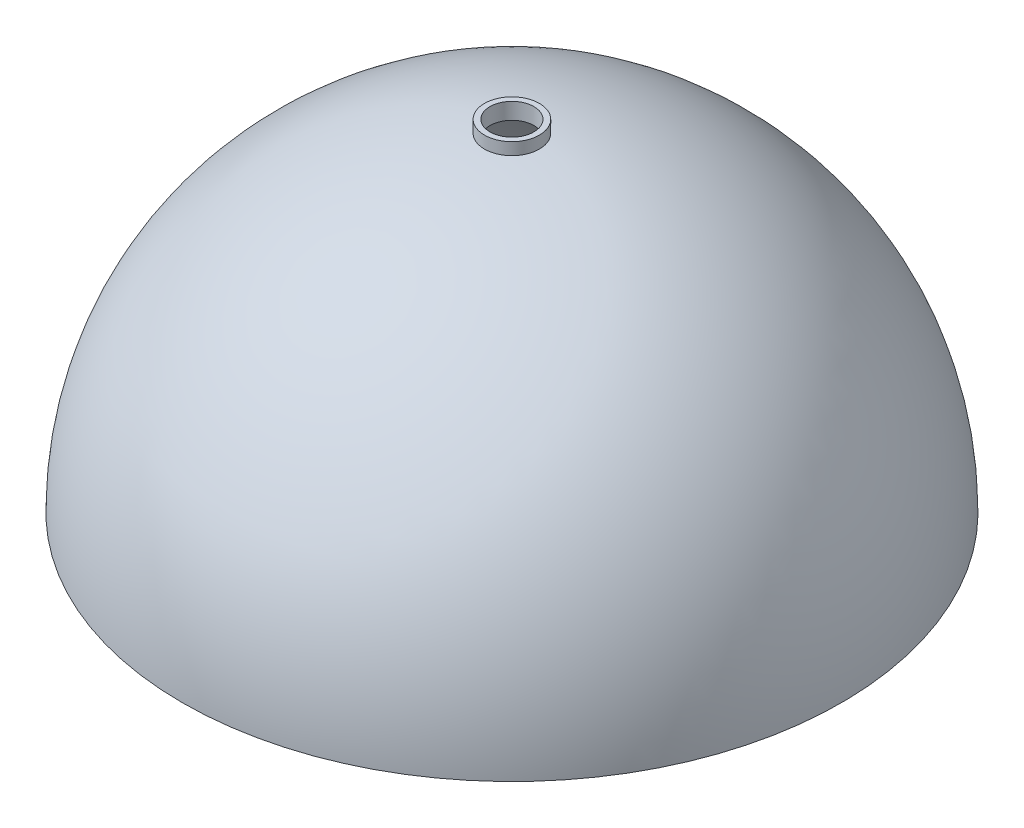
ISO-10303-21;
HEADER;
FILE_DESCRIPTION(('STEP AP214'),'2;1');
FILE_NAME('part.step','',(''),(''),'','','');
FILE_SCHEMA(('AUTOMOTIVE_DESIGN { 1 0 10303 214 1 1 1 1 }'));
ENDSEC;
DATA;
#1=APPLICATION_CONTEXT('core data for automotive mechanical design processes');
#2=APPLICATION_PROTOCOL_DEFINITION('international standard','automotive_design',2000,#1);
#3=PRODUCT_CONTEXT('',#1,'mechanical');
#4=PRODUCT('Part','Part','',(#3));
#5=PRODUCT_RELATED_PRODUCT_CATEGORY('part','',(#4));
#6=PRODUCT_DEFINITION_FORMATION('','',#4);
#7=PRODUCT_DEFINITION_CONTEXT('part definition',#1,'design');
#8=PRODUCT_DEFINITION('design','',#6,#7);
#9=PRODUCT_DEFINITION_SHAPE('','',#8);
#10=(LENGTH_UNIT() NAMED_UNIT(*) SI_UNIT(.MILLI.,.METRE.));
#11=(NAMED_UNIT(*) PLANE_ANGLE_UNIT() SI_UNIT($,.RADIAN.));
#12=(NAMED_UNIT(*) SI_UNIT($,.STERADIAN.) SOLID_ANGLE_UNIT());
#13=UNCERTAINTY_MEASURE_WITH_UNIT(LENGTH_MEASURE(1.E-05),#10,'distance_accuracy_value','');
#14=(GEOMETRIC_REPRESENTATION_CONTEXT(3) GLOBAL_UNCERTAINTY_ASSIGNED_CONTEXT((#13)) GLOBAL_UNIT_ASSIGNED_CONTEXT((#10,
#11,#12)) REPRESENTATION_CONTEXT('',''));
#15=CARTESIAN_POINT('',(0.,0.,0.));
#16=DIRECTION('',(0.,0.,1.));
#17=DIRECTION('',(1.,0.,0.));
#18=AXIS2_PLACEMENT_3D('',#15,#16,#17);
#19=CARTESIAN_POINT('',(300.,0.,0.));
#20=DIRECTION('',(0.,1.,0.));
#21=DIRECTION('',(1.,0.,0.));
#22=AXIS2_PLACEMENT_3D('',#19,#20,#21);
#23=SPHERICAL_SURFACE('',#22,300.);
#24=CARTESIAN_POINT('',(300.,0.,0.));
#25=DIRECTION('',(0.,1.,0.));
#26=DIRECTION('',(0.,0.,1.));
#27=AXIS2_PLACEMENT_3D('',#24,#25,#26);
#28=CIRCLE('',#27,300.);
#29=CARTESIAN_POINT('',(300.,0.,300.));
#30=VERTEX_POINT('',#29);
#31=EDGE_CURVE('E10',#30,#30,#28,.T.);
#32=ORIENTED_EDGE('',*,*,#31,.T.);
#33=EDGE_LOOP('',(#32));
#34=FACE_BOUND('',#33,.T.);
#35=CARTESIAN_POINT('',(300.,298.956518577535,0.));
#36=DIRECTION('',(0.,-1.,0.));
#37=DIRECTION('',(0.,0.,-1.));
#38=AXIS2_PLACEMENT_3D('',#35,#36,#37);
#39=CIRCLE('',#38,25.);
#40=CARTESIAN_POINT('',(300.,298.956518577535,-25.));
#41=VERTEX_POINT('',#40);
#42=EDGE_CURVE('E50',#41,#41,#39,.T.);
#43=ORIENTED_EDGE('',*,*,#42,.T.);
#44=EDGE_LOOP('',(#43));
#45=FACE_BOUND('',#44,.T.);
#46=ADVANCED_FACE('F38',(#34,#45),#23,.T.);
#47=CARTESIAN_POINT('',(5.,0.,0.));
#48=DIRECTION('',(0.,-1.,0.));
#49=DIRECTION('',(0.,0.,-1.));
#50=AXIS2_PLACEMENT_3D('',#47,#48,#49);
#51=PLANE('',#50);
#52=CARTESIAN_POINT('',(300.755316247792,1.11022302462516E-13,0.));
#53=DIRECTION('',(0.,1.,0.));
#54=DIRECTION('',(-1.,0.,0.));
#55=AXIS2_PLACEMENT_3D('',#52,#53,#54);
#56=CIRCLE('',#55,295.755316247792);
#57=CARTESIAN_POINT('',(5.00000000000006,0.,0.));
#58=VERTEX_POINT('',#57);
#59=EDGE_CURVE('E59',#58,#58,#56,.T.);
#60=ORIENTED_EDGE('',*,*,#59,.T.);
#61=EDGE_LOOP('',(#60));
#62=FACE_BOUND('',#61,.T.);
#63=ORIENTED_EDGE('',*,*,#31,.F.);
#64=EDGE_LOOP('',(#63));
#65=FACE_BOUND('',#64,.T.);
#66=ADVANCED_FACE('F80',(#62,#65),#51,.T.);
#67=CARTESIAN_POINT('',(300.,310.,0.));
#68=DIRECTION('',(0.,-1.,0.));
#69=DIRECTION('',(0.,0.,-1.));
#70=AXIS2_PLACEMENT_3D('',#67,#68,#69);
#71=CYLINDRICAL_SURFACE('',#70,25.);
#72=ORIENTED_EDGE('',*,*,#42,.F.);
#73=EDGE_LOOP('',(#72));
#74=FACE_BOUND('',#73,.T.);
#75=CARTESIAN_POINT('',(300.,310.,0.));
#76=DIRECTION('',(0.,1.,0.));
#77=DIRECTION('',(0.,0.,1.));
#78=AXIS2_PLACEMENT_3D('',#75,#76,#77);
#79=CIRCLE('',#78,25.);
#80=CARTESIAN_POINT('',(300.,310.,25.));
#81=VERTEX_POINT('',#80);
#82=EDGE_CURVE('E54',#81,#81,#79,.T.);
#83=ORIENTED_EDGE('',*,*,#82,.F.);
#84=EDGE_LOOP('',(#83));
#85=FACE_BOUND('',#84,.T.);
#86=ADVANCED_FACE('F84',(#74,#85),#71,.T.);
#87=CARTESIAN_POINT('',(300.,310.,0.));
#88=DIRECTION('',(0.,1.,0.));
#89=DIRECTION('',(0.,0.,1.));
#90=AXIS2_PLACEMENT_3D('',#87,#88,#89);
#91=PLANE('',#90);
#92=CARTESIAN_POINT('',(300.,310.,0.));
#93=DIRECTION('',(0.,1.,0.));
#94=DIRECTION('',(0.,0.,1.));
#95=AXIS2_PLACEMENT_3D('',#92,#93,#94);
#96=CIRCLE('',#95,20.);
#97=CARTESIAN_POINT('',(300.,310.,20.));
#98=VERTEX_POINT('',#97);
#99=EDGE_CURVE('E62',#98,#98,#96,.T.);
#100=ORIENTED_EDGE('',*,*,#99,.F.);
#101=EDGE_LOOP('',(#100));
#102=FACE_BOUND('',#101,.T.);
#103=ORIENTED_EDGE('',*,*,#82,.T.);
#104=EDGE_LOOP('',(#103));
#105=FACE_BOUND('',#104,.T.);
#106=ADVANCED_FACE('F77',(#102,#105),#91,.T.);
#107=CARTESIAN_POINT('',(300.755316247792,0.,0.));
#108=DIRECTION('',(0.,1.,0.));
#109=DIRECTION('',(1.,0.,0.));
#110=AXIS2_PLACEMENT_3D('',#107,#108,#109);
#111=SPHERICAL_SURFACE('',#110,295.755316247792);
#112=CARTESIAN_POINT('',(285.847257033059,295.041110682511,-14.1315203184832));
#113=CARTESIAN_POINT('',(285.450225363933,295.040094266485,-13.7338980953444));
#114=CARTESIAN_POINT('',(285.070010060208,295.039120895989,-13.3195781175993));
#115=CARTESIAN_POINT('',(284.345685122527,295.037266578881,-12.4602647606207));
#116=CARTESIAN_POINT('',(284.001585014438,295.036385656653,-12.0152633397725));
#117=CARTESIAN_POINT('',(283.35172384632,295.034721956465,-11.0973643367085));
#118=CARTESIAN_POINT('',(283.04600569095,295.033939288337,-10.6244363901003));
#119=CARTESIAN_POINT('',(282.47554035645,295.032478836702,-9.6545234708292));
#120=CARTESIAN_POINT('',(282.210790457871,295.031801046233,-9.15754009782919));
#121=CARTESIAN_POINT('',(281.724234285291,295.030555402335,-8.1432564094207));
#122=CARTESIAN_POINT('',(281.502408624278,295.029987499275,-7.62596539367835));
#123=CARTESIAN_POINT('',(281.103125467699,295.028965279248,-6.5745247194762));
#124=CARTESIAN_POINT('',(280.925668672817,295.028510964075,-6.04037479492639));
#125=CARTESIAN_POINT('',(280.616429441255,295.027719265236,-4.95916076584046));
#126=CARTESIAN_POINT('',(280.484635375314,295.027381851798,-4.41209998737107));
#127=CARTESIAN_POINT('',(280.267595997111,295.026826196462,-3.30882338721975));
#128=CARTESIAN_POINT('',(280.18235050268,295.026607954098,-2.75260760137471));
#129=CARTESIAN_POINT('',(280.059006974671,295.026292174389,-1.63491388115359));
#130=CARTESIAN_POINT('',(280.02091386739,295.026194649656,-1.07343540312539));
#131=CARTESIAN_POINT('',(279.992162213847,295.026121040619,0.0507352930846792));
#132=CARTESIAN_POINT('',(280.001503715597,295.026144956436,0.613427512494484));
#133=CARTESIAN_POINT('',(280.067556266926,295.026314061954,1.73604675235109));
#134=CARTESIAN_POINT('',(280.124269159905,295.026459256373,2.29597366433638));
#135=CARTESIAN_POINT('',(280.284663663196,295.026869892417,3.40905918344757));
#136=CARTESIAN_POINT('',(280.388345264307,295.027135334018,3.96221779189949));
#137=CARTESIAN_POINT('',(280.641937565494,295.027784569703,5.05782343166784));
#138=CARTESIAN_POINT('',(280.791847371218,295.028168361497,5.60027066999574));
#139=CARTESIAN_POINT('',(281.136830961723,295.02905157016,6.67060812996249));
#140=CARTESIAN_POINT('',(281.331904747298,295.029550987032,7.19849835134544));
#141=CARTESIAN_POINT('',(281.765828974798,295.030661890663,8.23596774096607));
#142=CARTESIAN_POINT('',(282.004679328241,295.031273377196,8.74554694621183));
#143=CARTESIAN_POINT('',(282.524458852033,295.032604073181,9.74277265741535));
#144=CARTESIAN_POINT('',(282.805388022391,295.033323282633,10.2304191633684));
#145=CARTESIAN_POINT('',(283.407328902969,295.034864310368,11.1803141831137));
#146=CARTESIAN_POINT('',(283.728340743162,295.035686128985,11.642562614542));
#147=CARTESIAN_POINT('',(284.408164018421,295.037426529214,12.5383734961908));
#148=CARTESIAN_POINT('',(284.766975453495,295.038345110828,12.9719359464052));
#149=CARTESIAN_POINT('',(285.519846286759,295.040272500011,13.8072917815297));
#150=CARTESIAN_POINT('',(285.913905621696,295.041281307418,14.2090852234479));
#151=CARTESIAN_POINT('',(286.734471274351,295.043381976979,14.9780474479762));
#152=CARTESIAN_POINT('',(287.1609775921,295.044473839133,15.3452162305549));
#153=CARTESIAN_POINT('',(288.043406438416,295.046732855498,16.0423199692476));
#154=CARTESIAN_POINT('',(288.499329062001,295.047900009951,16.3722548050826));
#155=CARTESIAN_POINT('',(289.437347943165,295.050301308645,16.9925436871255));
#156=CARTESIAN_POINT('',(289.919444200823,295.051535452885,17.2828977332149));
#157=CARTESIAN_POINT('',(290.906383468441,295.054061954134,17.8219611246588));
#158=CARTESIAN_POINT('',(291.411226502742,295.055354311204,18.0706704254516));
#159=CARTESIAN_POINT('',(292.440069721143,295.057988048909,18.5246758135345));
#160=CARTESIAN_POINT('',(292.96406990529,295.059329429545,18.7299719007183));
#161=CARTESIAN_POINT('',(294.027503605023,295.062051678821,19.0956918774945));
#162=CARTESIAN_POINT('',(294.566937163856,295.063432547573,19.2561156413311));
#163=CARTESIAN_POINT('',(295.657401163495,295.066223952097,19.5309497137831));
#164=CARTESIAN_POINT('',(296.208431604315,295.06763448787,19.6453600223352));
#165=CARTESIAN_POINT('',(297.318171663671,295.070475194761,19.8273537778325));
#166=CARTESIAN_POINT('',(297.876881279181,295.071905365872,19.8949372432223));
#167=CARTESIAN_POINT('',(298.998007828413,295.074775177756,19.9827969189661));
#168=CARTESIAN_POINT('',(299.560424762139,295.076214818528,20.0030731292829));
#169=CARTESIAN_POINT('',(300.68496874012,295.079093336526,19.9961741389977));
#170=CARTESIAN_POINT('',(301.247095783745,295.08053221375,19.9689988356065));
#171=CARTESIAN_POINT('',(302.367062378384,295.083398973445,19.8673898157148));
#172=CARTESIAN_POINT('',(302.924901929389,295.084826855916,19.7929560991259));
#173=CARTESIAN_POINT('',(304.03232770861,295.087661473595,19.597359408168));
#174=CARTESIAN_POINT('',(304.581913935714,295.089068208799,19.4761964275017));
#175=CARTESIAN_POINT('',(305.668925756228,295.091850533824,19.1880025892904));
#176=CARTESIAN_POINT('',(306.206351349645,295.093226123646,19.0209717317678));
#177=CARTESIAN_POINT('',(307.265221116985,295.095936378562,18.6422296095457));
#178=CARTESIAN_POINT('',(307.786665290945,295.097271043658,18.4305183449462));
#179=CARTESIAN_POINT('',(308.809865046718,295.099889963475,17.9639205262746));
#180=CARTESIAN_POINT('',(309.311620628526,295.101174218196,17.7090339721875));
#181=CARTESIAN_POINT('',(310.291875966925,295.103683186989,17.1578976569671));
#182=CARTESIAN_POINT('',(310.770375724681,295.104907901064,16.8616478979029));
#183=CARTESIAN_POINT('',(311.700717559939,295.10728908596,16.2298913016254));
#184=CARTESIAN_POINT('',(312.152559637489,295.108445556782,15.8943844644809));
#185=CARTESIAN_POINT('',(313.026372884477,295.110682032398,15.1864996454387));
#186=CARTESIAN_POINT('',(313.44834411261,295.111762037341,14.814121735994));
#187=CARTESIAN_POINT('',(314.259416637016,295.113837909266,14.0351415863412));
#188=CARTESIAN_POINT('',(314.64851793332,295.114833776247,13.628539346165));
#189=CARTESIAN_POINT('',(315.391084285313,295.116734292794,12.7840012083948));
#190=CARTESIAN_POINT('',(315.744549339814,295.117638942358,12.3460653097553));
#191=CARTESIAN_POINT('',(316.413330219779,295.119350597013,11.4419733279874));
#192=CARTESIAN_POINT('',(316.728646045323,295.120157602104,10.9758172449181));
#193=CARTESIAN_POINT('',(317.318885805303,295.121668229313,10.018600462668));
#194=CARTESIAN_POINT('',(317.593809863588,295.122371851748,9.52753983985633));
#195=CARTESIAN_POINT('',(318.101312659463,295.123670717645,8.52400380783032));
#196=CARTESIAN_POINT('',(318.333891397135,295.124265961106,8.01152839865787));
#197=CARTESIAN_POINT('',(318.755049989848,295.125343837052,6.96880627026342));
#198=CARTESIAN_POINT('',(318.94362985123,295.125826469553,6.43855955360258));
#199=CARTESIAN_POINT('',(319.275450012277,295.126675696073,5.3640644930608));
#200=CARTESIAN_POINT('',(319.418690312028,295.127042290093,4.81981614920662));
#201=CARTESIAN_POINT('',(319.65881260738,295.127656832498,3.72118880241856));
#202=CARTESIAN_POINT('',(319.755694743358,295.127904781243,3.16680983016676));
#203=CARTESIAN_POINT('',(319.902412567489,295.128280274052,2.05186093175147));
#204=CARTESIAN_POINT('',(319.952248255732,295.128407818117,1.49129100559991));
#205=CARTESIAN_POINT('',(320.004518885176,295.128541593266,0.367945301927288));
#206=CARTESIAN_POINT('',(320.006953807608,295.128547824302,-0.194830476467089));
#207=CARTESIAN_POINT('',(319.964405546255,295.12843893101,-1.31858665186408));
#208=CARTESIAN_POINT('',(319.919422362455,295.128323806682,-1.87956704886615));
#209=CARTESIAN_POINT('',(319.782357773656,295.127973019706,-2.99574361035108));
#210=CARTESIAN_POINT('',(319.690276419539,295.127737357188,-3.5509397810822));
#211=CARTESIAN_POINT('',(319.459670174259,295.127147169696,-4.65160139240395));
#212=CARTESIAN_POINT('',(319.32114528318,295.126792644721,-5.19706683301194));
#213=CARTESIAN_POINT('',(318.998636982057,295.125967249986,-6.27438848638361));
#214=CARTESIAN_POINT('',(318.814653620087,295.125496380349,-6.80624471353871));
#215=CARTESIAN_POINT('',(318.402536333429,295.124441644105,-7.85256737898445));
#216=CARTESIAN_POINT('',(318.174402408755,295.123857777498,-8.36703381728081));
#217=CARTESIAN_POINT('',(317.675605832173,295.12258119492,-9.37491954545177));
#218=CARTESIAN_POINT('',(317.404943166628,295.121888478915,-9.86833882857782));
#219=CARTESIAN_POINT('',(316.82301343035,295.120399121509,-10.8306221887151));
#220=CARTESIAN_POINT('',(316.511746359566,295.119602480109,-11.2994862656951));
#221=CARTESIAN_POINT('',(315.85082015221,295.117910929533,-12.2093267364718));
#222=CARTESIAN_POINT('',(315.501160946069,295.117016020178,-12.6503030797315));
#223=CARTESIAN_POINT('',(314.76593681484,295.115134296665,-13.5012321167265));
#224=CARTESIAN_POINT('',(314.380371889671,295.114147482506,-13.9111848103915));
#225=CARTESIAN_POINT('',(313.576077235347,295.112088960612,-14.6971523017209));
#226=CARTESIAN_POINT('',(313.157347486945,295.111017252827,-15.0731670796892));
#227=CARTESIAN_POINT('',(312.28970030591,295.10879656184,-15.7885852786612));
#228=CARTESIAN_POINT('',(311.8407828732,295.107647578638,-16.1279886995729));
#229=CARTESIAN_POINT('',(310.915950912217,295.105280498654,-16.7677719303268));
#230=CARTESIAN_POINT('',(310.440036328979,295.104062401731,-17.0681516607144));
#231=CARTESIAN_POINT('',(309.464594379245,295.101565755708,-17.6277512151185));
#232=CARTESIAN_POINT('',(308.965067013134,295.100287206609,-17.8869710398072));
#233=CARTESIAN_POINT('',(307.945939716973,295.097678714477,-18.3624131118501));
#234=CARTESIAN_POINT('',(307.426339350258,295.096348770326,-18.5786344231901));
#235=CARTESIAN_POINT('',(306.37077036002,295.093646967777,-18.9665352214201));
#236=CARTESIAN_POINT('',(305.83480173326,295.092275109372,-19.1382146994976));
#237=CARTESIAN_POINT('',(304.750328002976,295.08949928449,-19.4358054237349));
#238=CARTESIAN_POINT('',(304.201823388052,295.088095319265,-19.5617184504521));
#239=CARTESIAN_POINT('',(303.096157450434,295.085265210342,-19.7668904199504));
#240=CARTESIAN_POINT('',(302.538996136502,295.083839066667,-19.8461494099499));
#241=CARTESIAN_POINT('',(301.420035281221,295.080974886021,-19.9574442750038));
#242=CARTESIAN_POINT('',(300.858236227156,295.079536850299,-19.9894850493083));
#243=CARTESIAN_POINT('',(299.733933636018,295.076658954567,-20.0061313961618));
#244=CARTESIAN_POINT('',(299.171430096196,295.075219094549,-19.9907367830448));
#245=CARTESIAN_POINT('',(298.049575590132,295.072347423179,-19.9126113299251));
#246=CARTESIAN_POINT('',(297.490225464164,295.070915613974,-19.849868423065));
#247=CARTESIAN_POINT('',(296.378809359703,295.068070620922,-19.6774799070354));
#248=CARTESIAN_POINT('',(295.826743266324,295.066657436782,-19.567835038527));
#249=CARTESIAN_POINT('',(294.733563046191,295.063859083694,-19.3023615540851));
#250=CARTESIAN_POINT('',(294.192454002558,295.062473927748,-19.1465120048421));
#251=CARTESIAN_POINT('',(293.125264572827,295.059742068154,-18.7897468759389));
#252=CARTESIAN_POINT('',(292.599185187239,295.058395367067,-18.5888283039209));
#253=CARTESIAN_POINT('',(291.566400497334,295.055751542802,-18.1436004714829));
#254=CARTESIAN_POINT('',(291.059674392949,295.054454366399,-17.8993394851011));
#255=CARTESIAN_POINT('',(290.068746762165,295.051917658447,-17.3691097561455));
#256=CARTESIAN_POINT('',(289.584539345902,295.050678111825,-17.0831520013941));
#257=CARTESIAN_POINT('',(288.524508531654,295.047964470625,-16.3952841882659));
#258=CARTESIAN_POINT('',(287.95587365868,295.046508774414,-15.982228060386));
#259=CARTESIAN_POINT('',(286.865168809137,295.043716567198,-15.0986357884928));
#260=CARTESIAN_POINT('',(286.343098832576,295.042380056192,-14.6280996444683));
#261=CARTESIAN_POINT('',(285.847257033059,295.041110682511,-14.1315203184832));
#262=B_SPLINE_CURVE_WITH_KNOTS('',3,(#112,#113,#114,#115,#116,#117,#118,#119,#120,#121,#122,
#123,#124,#125,#126,#127,#128,#129,#130,#131,#132,#133,#134,#135,#136,#137,#138,#139,#140,#141,
#142,#143,#144,#145,#146,#147,#148,#149,#150,#151,#152,#153,#154,#155,#156,#157,#158,#159,#160,
#161,#162,#163,#164,#165,#166,#167,#168,#169,#170,#171,#172,#173,#174,#175,#176,#177,#178,#179,
#180,#181,#182,#183,#184,#185,#186,#187,#188,#189,#190,#191,#192,#193,#194,#195,#196,#197,#198,
#199,#200,#201,#202,#203,#204,#205,#206,#207,#208,#209,#210,#211,#212,#213,#214,#215,#216,#217,
#218,#219,#220,#221,#222,#223,#224,#225,#226,#227,#228,#229,#230,#231,#232,#233,#234,#235,#236,
#237,#238,#239,#240,#241,#242,#243,#244,#245,#246,#247,#248,#249,#250,#251,#252,#253,#254,#255,
#256,#257,#258,#259,#260,#261),.UNSPECIFIED.,.T.,.F.,(4,2,2,2,2,2,2,2,2,2,2,2,2,2,2,2,2,2,2,2,2,
2,2,2,2,2,2,2,2,2,2,2,2,2,2,2,2,2,2,2,2,2,2,2,2,2,2,2,2,2,2,2,2,2,2,2,2,2,2,2,2,2,2,2,2,2,2,2,2,
2,2,2,2,2,4),(0.,1.68510571570721,3.37065478951283,5.05807156180815,6.74537627625559,
8.43191712056873,10.118484597467,11.8046222276135,13.4907532590131,15.1770604359321,
16.8633693196855,18.549743827152,20.2361180042261,21.9224595579167,23.6088011412523,
25.2951393161604,26.9814774914288,28.6678211350371,30.3541647790057,32.0405053968346,
33.7268460161942,35.4131920828834,37.09953815462,38.7858860308089,40.4722339111288,
42.1585865174331,43.8449391260612,45.5312910704529,47.2176430161725,48.9039986148706,
50.590354216731,52.2767100458505,53.9630658741433,55.6494216986591,57.3357775237642,
59.0221332645144,60.7084890023125,62.394841426423,64.0811938489664,65.7675463277885,
67.4538988030886,69.1402461075482,70.8265934087097,72.5129404668381,74.1992875217439,
75.8856294701506,77.5719714153071,79.2583140281625,80.9446566415318,82.630997433084,
84.3173382216276,86.0036772268318,87.6900162314802,89.376355776832,91.0626953243272,
92.7490379276442,94.4353805347812,96.1217241205964,97.8080677106515,99.4944147341496,
101.180761730102,102.867145431326,104.5535294662,106.23984788478,107.926164596637,
109.612306327943,111.298454658951,112.985032855206,114.671584418527,116.35890125494,
118.04633015393,119.731891287366,121.417009046219,123.521490666366,125.625972286921),.UNSPECIFIED.);
#263=CARTESIAN_POINT('',(285.847257033059,295.041110682511,-14.1315203184832));
#264=VERTEX_POINT('',#263);
#265=EDGE_CURVE('E41',#264,#264,#262,.T.);
#266=ORIENTED_EDGE('',*,*,#265,.T.);
#267=EDGE_LOOP('',(#266));
#268=FACE_BOUND('',#267,.T.);
#269=ORIENTED_EDGE('',*,*,#59,.F.);
#270=EDGE_LOOP('',(#269));
#271=FACE_BOUND('',#270,.T.);
#272=ADVANCED_FACE('F69',(#268,#271),#111,.F.);
#273=CARTESIAN_POINT('',(300.,-20.,0.));
#274=DIRECTION('',(0.,1.,0.));
#275=DIRECTION('',(0.,0.,1.));
#276=AXIS2_PLACEMENT_3D('',#273,#274,#275);
#277=CYLINDRICAL_SURFACE('',#276,20.);
#278=ORIENTED_EDGE('',*,*,#99,.T.);
#279=EDGE_LOOP('',(#278));
#280=FACE_BOUND('',#279,.T.);
#281=ORIENTED_EDGE('',*,*,#265,.F.);
#282=EDGE_LOOP('',(#281));
#283=FACE_BOUND('',#282,.T.);
#284=ADVANCED_FACE('F72',(#280,#283),#277,.F.);
#285=CLOSED_SHELL('',(#46,#66,#86,#106,#272,#284));
#286=MANIFOLD_SOLID_BREP('B2',#285);
#287=ADVANCED_BREP_SHAPE_REPRESENTATION('',(#18,#286),#14);
#288=SHAPE_DEFINITION_REPRESENTATION(#9,#287);
ENDSEC;
END-ISO-10303-21;
